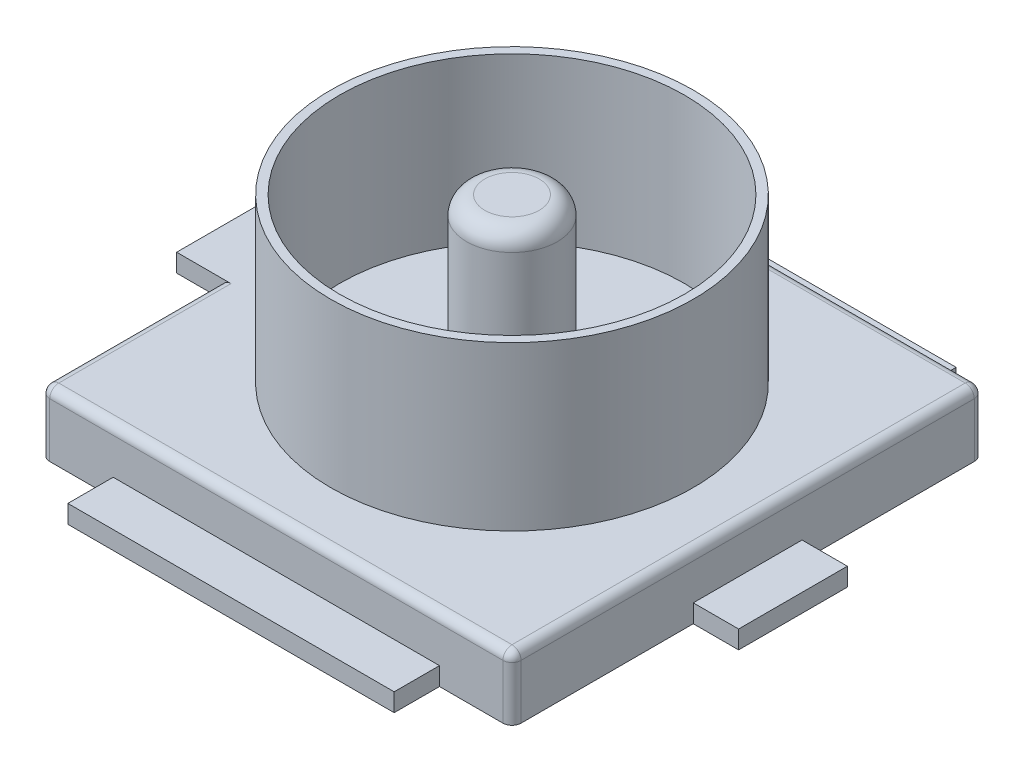
ISO-10303-21;
HEADER;
FILE_DESCRIPTION(('STEP AP214'),'2;1');
FILE_NAME('part.step','',(''),(''),'','','');
FILE_SCHEMA(('AUTOMOTIVE_DESIGN { 1 0 10303 214 1 1 1 1 }'));
ENDSEC;
DATA;
#1=APPLICATION_CONTEXT('core data for automotive mechanical design processes');
#2=APPLICATION_PROTOCOL_DEFINITION('international standard','automotive_design',2000,#1);
#3=PRODUCT_CONTEXT('',#1,'mechanical');
#4=PRODUCT('Part','Part','',(#3));
#5=PRODUCT_RELATED_PRODUCT_CATEGORY('part','',(#4));
#6=PRODUCT_DEFINITION_FORMATION('','',#4);
#7=PRODUCT_DEFINITION_CONTEXT('part definition',#1,'design');
#8=PRODUCT_DEFINITION('design','',#6,#7);
#9=PRODUCT_DEFINITION_SHAPE('','',#8);
#10=(LENGTH_UNIT() NAMED_UNIT(*) SI_UNIT(.MILLI.,.METRE.));
#11=(NAMED_UNIT(*) PLANE_ANGLE_UNIT() SI_UNIT($,.RADIAN.));
#12=(NAMED_UNIT(*) SI_UNIT($,.STERADIAN.) SOLID_ANGLE_UNIT());
#13=UNCERTAINTY_MEASURE_WITH_UNIT(LENGTH_MEASURE(1.E-05),#10,'distance_accuracy_value','');
#14=(GEOMETRIC_REPRESENTATION_CONTEXT(3) GLOBAL_UNCERTAINTY_ASSIGNED_CONTEXT((#13)) GLOBAL_UNIT_ASSIGNED_CONTEXT((#10,
#11,#12)) REPRESENTATION_CONTEXT('',''));
#15=CARTESIAN_POINT('',(0.,0.,0.));
#16=DIRECTION('',(0.,0.,1.));
#17=DIRECTION('',(1.,0.,0.));
#18=AXIS2_PLACEMENT_3D('',#15,#16,#17);
#19=CARTESIAN_POINT('',(0.,0.35,0.));
#20=DIRECTION('',(1.,0.,0.));
#21=DIRECTION('',(0.,0.,-1.));
#22=AXIS2_PLACEMENT_3D('',#19,#20,#21);
#23=PLANE('',#22);
#24=DIRECTION('',(0.,0.,1.));
#25=VECTOR('',#24,1.);
#26=CARTESIAN_POINT('',(0.,0.3,0.));
#27=LINE('',#26,#25);
#28=CARTESIAN_POINT('',(0.,0.3,-1.6));
#29=VERTEX_POINT('',#28);
#30=CARTESIAN_POINT('',(0.,0.3,-2.55));
#31=VERTEX_POINT('',#30);
#32=EDGE_CURVE('E291',#29,#31,#27,.F.);
#33=ORIENTED_EDGE('',*,*,#32,.T.);
#34=DIRECTION('',(0.,-1.,0.));
#35=VECTOR('',#34,1.);
#36=CARTESIAN_POINT('',(0.,0.35,-2.55));
#37=LINE('',#36,#35);
#38=CARTESIAN_POINT('',(0.,0.,-2.55));
#39=VERTEX_POINT('',#38);
#40=EDGE_CURVE('E331',#31,#39,#37,.T.);
#41=ORIENTED_EDGE('',*,*,#40,.T.);
#42=DIRECTION('',(0.,0.,1.));
#43=VECTOR('',#42,1.);
#44=CARTESIAN_POINT('',(0.,0.,0.));
#45=LINE('',#44,#43);
#46=CARTESIAN_POINT('',(0.,0.,-0.05));
#47=VERTEX_POINT('',#46);
#48=EDGE_CURVE('E431',#39,#47,#45,.T.);
#49=ORIENTED_EDGE('',*,*,#48,.T.);
#50=DIRECTION('',(0.,-1.,0.));
#51=VECTOR('',#50,1.);
#52=CARTESIAN_POINT('',(0.,0.35,-0.05));
#53=LINE('',#52,#51);
#54=CARTESIAN_POINT('',(0.,0.3,-0.05));
#55=VERTEX_POINT('',#54);
#56=EDGE_CURVE('E329',#47,#55,#53,.F.);
#57=ORIENTED_EDGE('',*,*,#56,.T.);
#58=DIRECTION('',(0.,0.,1.));
#59=VECTOR('',#58,1.);
#60=CARTESIAN_POINT('',(0.,0.3,0.));
#61=LINE('',#60,#59);
#62=CARTESIAN_POINT('',(0.,0.3,-0.999999999999999));
#63=VERTEX_POINT('',#62);
#64=EDGE_CURVE('E294',#55,#63,#61,.F.);
#65=ORIENTED_EDGE('',*,*,#64,.T.);
#66=DIRECTION('',(0.,1.,0.));
#67=VECTOR('',#66,1.);
#68=CARTESIAN_POINT('',(0.,0.35,-0.999999999999999));
#69=LINE('',#68,#67);
#70=CARTESIAN_POINT('',(0.,0.25,-0.999999999999999));
#71=VERTEX_POINT('',#70);
#72=EDGE_CURVE('E247',#71,#63,#69,.T.);
#73=ORIENTED_EDGE('',*,*,#72,.F.);
#74=DIRECTION('',(0.,0.,1.));
#75=VECTOR('',#74,1.);
#76=CARTESIAN_POINT('',(0.,0.25,-1.6));
#77=LINE('',#76,#75);
#78=CARTESIAN_POINT('',(0.,0.25,-1.6));
#79=VERTEX_POINT('',#78);
#80=EDGE_CURVE('E287',#79,#71,#77,.T.);
#81=ORIENTED_EDGE('',*,*,#80,.F.);
#82=DIRECTION('',(0.,-1.,0.));
#83=VECTOR('',#82,1.);
#84=CARTESIAN_POINT('',(0.,0.35,-1.6));
#85=LINE('',#84,#83);
#86=EDGE_CURVE('E251',#29,#79,#85,.T.);
#87=ORIENTED_EDGE('',*,*,#86,.F.);
#88=EDGE_LOOP('',(#33,#41,#49,#57,#65,#73,#81,#87));
#89=FACE_BOUND('',#88,.T.);
#90=ADVANCED_FACE('F45',(#89),#23,.F.);
#91=CARTESIAN_POINT('',(0.,0.35,-2.6));
#92=DIRECTION('',(0.,0.,1.));
#93=DIRECTION('',(1.,0.,0.));
#94=AXIS2_PLACEMENT_3D('',#91,#92,#93);
#95=PLANE('',#94);
#96=DIRECTION('',(-1.,0.,0.));
#97=VECTOR('',#96,1.);
#98=CARTESIAN_POINT('',(0.,0.,-2.6));
#99=LINE('',#98,#97);
#100=CARTESIAN_POINT('',(0.4,0.,-2.6));
#101=VERTEX_POINT('',#100);
#102=CARTESIAN_POINT('',(0.05,0.,-2.6));
#103=VERTEX_POINT('',#102);
#104=EDGE_CURVE('E338',#101,#103,#99,.T.);
#105=ORIENTED_EDGE('',*,*,#104,.T.);
#106=DIRECTION('',(0.,-1.,0.));
#107=VECTOR('',#106,1.);
#108=CARTESIAN_POINT('',(0.05,0.35,-2.6));
#109=LINE('',#108,#107);
#110=CARTESIAN_POINT('',(0.05,0.3,-2.6));
#111=VERTEX_POINT('',#110);
#112=EDGE_CURVE('E449',#103,#111,#109,.F.);
#113=ORIENTED_EDGE('',*,*,#112,.T.);
#114=DIRECTION('',(-1.,0.,0.));
#115=VECTOR('',#114,1.);
#116=CARTESIAN_POINT('',(0.,0.3,-2.6));
#117=LINE('',#116,#115);
#118=CARTESIAN_POINT('',(2.55,0.3,-2.6));
#119=VERTEX_POINT('',#118);
#120=EDGE_CURVE('E296',#111,#119,#117,.F.);
#121=ORIENTED_EDGE('',*,*,#120,.T.);
#122=DIRECTION('',(0.,-1.,0.));
#123=VECTOR('',#122,1.);
#124=CARTESIAN_POINT('',(2.55,0.35,-2.6));
#125=LINE('',#124,#123);
#126=CARTESIAN_POINT('',(2.55,0.,-2.6));
#127=VERTEX_POINT('',#126);
#128=EDGE_CURVE('E447',#119,#127,#125,.T.);
#129=ORIENTED_EDGE('',*,*,#128,.T.);
#130=CARTESIAN_POINT('',(2.2,0.,-2.6));
#131=VERTEX_POINT('',#130);
#132=EDGE_CURVE('E334',#127,#131,#99,.T.);
#133=ORIENTED_EDGE('',*,*,#132,.T.);
#134=DIRECTION('',(0.,-1.,0.));
#135=VECTOR('',#134,1.);
#136=CARTESIAN_POINT('',(2.2,0.,-2.6));
#137=LINE('',#136,#135);
#138=CARTESIAN_POINT('',(2.2,0.1,-2.6));
#139=VERTEX_POINT('',#138);
#140=EDGE_CURVE('E253',#139,#131,#137,.T.);
#141=ORIENTED_EDGE('',*,*,#140,.F.);
#142=DIRECTION('',(1.,0.,0.));
#143=VECTOR('',#142,1.);
#144=CARTESIAN_POINT('',(2.2,0.1,-2.6));
#145=LINE('',#144,#143);
#146=CARTESIAN_POINT('',(0.4,0.1,-2.6));
#147=VERTEX_POINT('',#146);
#148=EDGE_CURVE('E266',#147,#139,#145,.T.);
#149=ORIENTED_EDGE('',*,*,#148,.F.);
#150=DIRECTION('',(0.,1.,0.));
#151=VECTOR('',#150,1.);
#152=CARTESIAN_POINT('',(0.4,0.,-2.6));
#153=LINE('',#152,#151);
#154=EDGE_CURVE('E256',#101,#147,#153,.T.);
#155=ORIENTED_EDGE('',*,*,#154,.F.);
#156=EDGE_LOOP('',(#105,#113,#121,#129,#133,#141,#149,#155));
#157=FACE_BOUND('',#156,.T.);
#158=ADVANCED_FACE('F474',(#157),#95,.F.);
#159=CARTESIAN_POINT('',(0.,0.35,0.));
#160=DIRECTION('',(0.,0.,-1.));
#161=DIRECTION('',(-1.,0.,0.));
#162=AXIS2_PLACEMENT_3D('',#159,#160,#161);
#163=PLANE('',#162);
#164=DIRECTION('',(1.,0.,0.));
#165=VECTOR('',#164,1.);
#166=CARTESIAN_POINT('',(0.,0.3,0.));
#167=LINE('',#166,#165);
#168=CARTESIAN_POINT('',(2.55,0.3,0.));
#169=VERTEX_POINT('',#168);
#170=CARTESIAN_POINT('',(0.05,0.3,0.));
#171=VERTEX_POINT('',#170);
#172=EDGE_CURVE('E299',#169,#171,#167,.F.);
#173=ORIENTED_EDGE('',*,*,#172,.T.);
#174=DIRECTION('',(0.,-1.,0.));
#175=VECTOR('',#174,1.);
#176=CARTESIAN_POINT('',(0.05,0.35,0.));
#177=LINE('',#176,#175);
#178=CARTESIAN_POINT('',(0.05,0.,0.));
#179=VERTEX_POINT('',#178);
#180=EDGE_CURVE('E62',#171,#179,#177,.T.);
#181=ORIENTED_EDGE('',*,*,#180,.T.);
#182=DIRECTION('',(1.,0.,0.));
#183=VECTOR('',#182,1.);
#184=CARTESIAN_POINT('',(0.,0.,0.));
#185=LINE('',#184,#183);
#186=CARTESIAN_POINT('',(0.399999999999999,0.,0.));
#187=VERTEX_POINT('',#186);
#188=EDGE_CURVE('E438',#179,#187,#185,.T.);
#189=ORIENTED_EDGE('',*,*,#188,.T.);
#190=DIRECTION('',(0.,-1.,0.));
#191=VECTOR('',#190,1.);
#192=CARTESIAN_POINT('',(0.399999999999999,0.,0.));
#193=LINE('',#192,#191);
#194=CARTESIAN_POINT('',(0.399999999999999,0.1,0.));
#195=VERTEX_POINT('',#194);
#196=EDGE_CURVE('E352',#195,#187,#193,.T.);
#197=ORIENTED_EDGE('',*,*,#196,.F.);
#198=DIRECTION('',(-1.,0.,0.));
#199=VECTOR('',#198,1.);
#200=CARTESIAN_POINT('',(0.399999999999999,0.1,0.));
#201=LINE('',#200,#199);
#202=CARTESIAN_POINT('',(2.2,0.1,0.));
#203=VERTEX_POINT('',#202);
#204=EDGE_CURVE('E374',#203,#195,#201,.T.);
#205=ORIENTED_EDGE('',*,*,#204,.F.);
#206=DIRECTION('',(0.,1.,0.));
#207=VECTOR('',#206,1.);
#208=CARTESIAN_POINT('',(2.2,0.,0.));
#209=LINE('',#208,#207);
#210=CARTESIAN_POINT('',(2.2,0.,0.));
#211=VERTEX_POINT('',#210);
#212=EDGE_CURVE('E369',#211,#203,#209,.T.);
#213=ORIENTED_EDGE('',*,*,#212,.F.);
#214=CARTESIAN_POINT('',(2.55,0.,0.));
#215=VERTEX_POINT('',#214);
#216=EDGE_CURVE('E385',#211,#215,#185,.T.);
#217=ORIENTED_EDGE('',*,*,#216,.T.);
#218=DIRECTION('',(0.,-1.,0.));
#219=VECTOR('',#218,1.);
#220=CARTESIAN_POINT('',(2.55,0.35,0.));
#221=LINE('',#220,#219);
#222=EDGE_CURVE('E451',#215,#169,#221,.F.);
#223=ORIENTED_EDGE('',*,*,#222,.T.);
#224=EDGE_LOOP('',(#173,#181,#189,#197,#205,#213,#217,#223));
#225=FACE_BOUND('',#224,.T.);
#226=ADVANCED_FACE('F528',(#225),#163,.F.);
#227=CARTESIAN_POINT('',(2.6,0.35,0.));
#228=DIRECTION('',(-1.,0.,0.));
#229=DIRECTION('',(0.,0.,1.));
#230=AXIS2_PLACEMENT_3D('',#227,#228,#229);
#231=PLANE('',#230);
#232=DIRECTION('',(0.,0.,-1.));
#233=VECTOR('',#232,1.);
#234=CARTESIAN_POINT('',(2.6,0.3,0.));
#235=LINE('',#234,#233);
#236=CARTESIAN_POINT('',(2.6,0.3,-2.55));
#237=VERTEX_POINT('',#236);
#238=CARTESIAN_POINT('',(2.6,0.3,-0.05));
#239=VERTEX_POINT('',#238);
#240=EDGE_CURVE('E301',#237,#239,#235,.F.);
#241=ORIENTED_EDGE('',*,*,#240,.T.);
#242=DIRECTION('',(0.,-1.,0.));
#243=VECTOR('',#242,1.);
#244=CARTESIAN_POINT('',(2.6,0.35,-0.05));
#245=LINE('',#244,#243);
#246=CARTESIAN_POINT('',(2.6,0.,-0.05));
#247=VERTEX_POINT('',#246);
#248=EDGE_CURVE('E12',#239,#247,#245,.T.);
#249=ORIENTED_EDGE('',*,*,#248,.T.);
#250=DIRECTION('',(0.,0.,-1.));
#251=VECTOR('',#250,1.);
#252=CARTESIAN_POINT('',(2.6,0.,0.));
#253=LINE('',#252,#251);
#254=CARTESIAN_POINT('',(2.6,0.,-0.999999999999999));
#255=VERTEX_POINT('',#254);
#256=EDGE_CURVE('E339',#247,#255,#253,.T.);
#257=ORIENTED_EDGE('',*,*,#256,.T.);
#258=DIRECTION('',(0.,-1.,0.));
#259=VECTOR('',#258,1.);
#260=CARTESIAN_POINT('',(2.6,0.,-0.999999999999999));
#261=LINE('',#260,#259);
#262=CARTESIAN_POINT('',(2.6,0.1,-0.999999999999999));
#263=VERTEX_POINT('',#262);
#264=EDGE_CURVE('E396',#263,#255,#261,.T.);
#265=ORIENTED_EDGE('',*,*,#264,.F.);
#266=DIRECTION('',(0.,0.,1.));
#267=VECTOR('',#266,1.);
#268=CARTESIAN_POINT('',(2.6,0.1,-0.999999999999999));
#269=LINE('',#268,#267);
#270=CARTESIAN_POINT('',(2.6,0.1,-1.6));
#271=VERTEX_POINT('',#270);
#272=EDGE_CURVE('E404',#271,#263,#269,.T.);
#273=ORIENTED_EDGE('',*,*,#272,.F.);
#274=DIRECTION('',(0.,1.,0.));
#275=VECTOR('',#274,1.);
#276=CARTESIAN_POINT('',(2.6,0.,-1.6));
#277=LINE('',#276,#275);
#278=CARTESIAN_POINT('',(2.6,0.,-1.6));
#279=VERTEX_POINT('',#278);
#280=EDGE_CURVE('E399',#279,#271,#277,.T.);
#281=ORIENTED_EDGE('',*,*,#280,.F.);
#282=CARTESIAN_POINT('',(2.6,0.,-2.55));
#283=VERTEX_POINT('',#282);
#284=EDGE_CURVE('E440',#279,#283,#253,.T.);
#285=ORIENTED_EDGE('',*,*,#284,.T.);
#286=DIRECTION('',(0.,-1.,0.));
#287=VECTOR('',#286,1.);
#288=CARTESIAN_POINT('',(2.6,0.35,-2.55));
#289=LINE('',#288,#287);
#290=EDGE_CURVE('E54',#283,#237,#289,.F.);
#291=ORIENTED_EDGE('',*,*,#290,.T.);
#292=EDGE_LOOP('',(#241,#249,#257,#265,#273,#281,#285,#291));
#293=FACE_BOUND('',#292,.T.);
#294=ADVANCED_FACE('F483',(#293),#231,.F.);
#295=CARTESIAN_POINT('',(0.,0.35,0.));
#296=DIRECTION('',(0.,-1.,0.));
#297=DIRECTION('',(0.,0.,-1.));
#298=AXIS2_PLACEMENT_3D('',#295,#296,#297);
#299=PLANE('',#298);
#300=CARTESIAN_POINT('',(1.3,0.35,-1.3));
#301=DIRECTION('',(0.,1.,0.));
#302=DIRECTION('',(0.,0.,1.));
#303=AXIS2_PLACEMENT_3D('',#300,#301,#302);
#304=CIRCLE('',#303,0.951541018536383);
#305=CARTESIAN_POINT('',(1.3,0.35,-0.348458981463616));
#306=VERTEX_POINT('',#305);
#307=EDGE_CURVE('E428',#306,#306,#304,.T.);
#308=ORIENTED_EDGE('',*,*,#307,.T.);
#309=EDGE_LOOP('',(#308));
#310=FACE_BOUND('',#309,.T.);
#311=CARTESIAN_POINT('',(1.3,0.35,-1.3));
#312=DIRECTION('',(0.,-1.,0.));
#313=DIRECTION('',(0.,0.,-1.));
#314=AXIS2_PLACEMENT_3D('',#311,#312,#313);
#315=CIRCLE('',#314,0.25);
#316=CARTESIAN_POINT('',(1.3,0.35,-1.55));
#317=VERTEX_POINT('',#316);
#318=EDGE_CURVE('E337',#317,#317,#315,.F.);
#319=ORIENTED_EDGE('',*,*,#318,.F.);
#320=EDGE_LOOP('',(#319));
#321=FACE_BOUND('',#320,.T.);
#322=ADVANCED_FACE('F794',(#310,#321),#299,.F.);
#323=CARTESIAN_POINT('',(1.3,1.25,-1.3));
#324=DIRECTION('',(0.,-1.,0.));
#325=DIRECTION('',(0.,0.,-1.));
#326=AXIS2_PLACEMENT_3D('',#323,#324,#325);
#327=CYLINDRICAL_SURFACE('',#326,0.25);
#328=CARTESIAN_POINT('',(1.3,1.15,-1.3));
#329=DIRECTION('',(0.,1.,0.));
#330=DIRECTION('',(0.,0.,1.));
#331=AXIS2_PLACEMENT_3D('',#328,#329,#330);
#332=CIRCLE('',#331,0.25);
#333=CARTESIAN_POINT('',(1.3,1.15,-1.05));
#334=VERTEX_POINT('',#333);
#335=EDGE_CURVE('E905',#334,#334,#332,.F.);
#336=ORIENTED_EDGE('',*,*,#335,.T.);
#337=EDGE_LOOP('',(#336));
#338=FACE_BOUND('',#337,.T.);
#339=ORIENTED_EDGE('',*,*,#318,.T.);
#340=EDGE_LOOP('',(#339));
#341=FACE_BOUND('',#340,.T.);
#342=ADVANCED_FACE('F798',(#338,#341),#327,.T.);
#343=CARTESIAN_POINT('',(0.,1.25,0.));
#344=DIRECTION('',(0.,1.,0.));
#345=DIRECTION('',(0.,0.,1.));
#346=AXIS2_PLACEMENT_3D('',#343,#344,#345);
#347=PLANE('',#346);
#348=CARTESIAN_POINT('',(1.3,1.25,-1.3));
#349=DIRECTION('',(0.,1.,0.));
#350=DIRECTION('',(0.,0.,1.));
#351=AXIS2_PLACEMENT_3D('',#348,#349,#350);
#352=CIRCLE('',#351,0.15);
#353=CARTESIAN_POINT('',(1.3,1.25,-1.15));
#354=VERTEX_POINT('',#353);
#355=EDGE_CURVE('E908',#354,#354,#352,.T.);
#356=ORIENTED_EDGE('',*,*,#355,.T.);
#357=EDGE_LOOP('',(#356));
#358=FACE_BOUND('',#357,.T.);
#359=ADVANCED_FACE('F786',(#358),#347,.T.);
#360=CARTESIAN_POINT('',(1.3,1.25,-1.3));
#361=DIRECTION('',(0.,-1.,0.));
#362=DIRECTION('',(0.,0.,-1.));
#363=AXIS2_PLACEMENT_3D('',#360,#361,#362);
#364=CYLINDRICAL_SURFACE('',#363,0.951541018536383);
#365=CARTESIAN_POINT('',(1.3,1.25,-1.3));
#366=DIRECTION('',(0.,1.,0.));
#367=DIRECTION('',(0.,0.,1.));
#368=AXIS2_PLACEMENT_3D('',#365,#366,#367);
#369=CIRCLE('',#368,0.951541018536383);
#370=CARTESIAN_POINT('',(1.3,1.25,-0.348458981463616));
#371=VERTEX_POINT('',#370);
#372=EDGE_CURVE('E424',#371,#371,#369,.T.);
#373=ORIENTED_EDGE('',*,*,#372,.T.);
#374=EDGE_LOOP('',(#373));
#375=FACE_BOUND('',#374,.T.);
#376=ORIENTED_EDGE('',*,*,#307,.F.);
#377=EDGE_LOOP('',(#376));
#378=FACE_BOUND('',#377,.T.);
#379=ADVANCED_FACE('F776',(#375,#378),#364,.F.);
#380=CARTESIAN_POINT('',(1.3,1.25,-1.3));
#381=DIRECTION('',(0.,-1.,0.));
#382=DIRECTION('',(0.,0.,-1.));
#383=AXIS2_PLACEMENT_3D('',#380,#381,#382);
#384=CYLINDRICAL_SURFACE('',#383,1.);
#385=CARTESIAN_POINT('',(1.3,1.25,-1.3));
#386=DIRECTION('',(0.,1.,0.));
#387=DIRECTION('',(0.,0.,1.));
#388=AXIS2_PLACEMENT_3D('',#385,#386,#387);
#389=CIRCLE('',#388,1.);
#390=CARTESIAN_POINT('',(1.3,1.25,-0.299999999999999));
#391=VERTEX_POINT('',#390);
#392=EDGE_CURVE('E427',#391,#391,#389,.T.);
#393=ORIENTED_EDGE('',*,*,#392,.F.);
#394=EDGE_LOOP('',(#393));
#395=FACE_BOUND('',#394,.T.);
#396=CARTESIAN_POINT('',(1.3,0.35,-1.3));
#397=DIRECTION('',(0.,-1.,0.));
#398=DIRECTION('',(0.,0.,-1.));
#399=AXIS2_PLACEMENT_3D('',#396,#397,#398);
#400=CIRCLE('',#399,1.);
#401=CARTESIAN_POINT('',(1.3,0.35,-2.3));
#402=VERTEX_POINT('',#401);
#403=EDGE_CURVE('E486',#402,#402,#400,.F.);
#404=ORIENTED_EDGE('',*,*,#403,.T.);
#405=EDGE_LOOP('',(#404));
#406=FACE_BOUND('',#405,.T.);
#407=ADVANCED_FACE('F764',(#395,#406),#384,.T.);
#408=CARTESIAN_POINT('',(0.,1.25,0.));
#409=DIRECTION('',(0.,1.,0.));
#410=DIRECTION('',(0.,0.,1.));
#411=AXIS2_PLACEMENT_3D('',#408,#409,#410);
#412=PLANE('',#411);
#413=ORIENTED_EDGE('',*,*,#372,.F.);
#414=EDGE_LOOP('',(#413));
#415=FACE_BOUND('',#414,.T.);
#416=ORIENTED_EDGE('',*,*,#392,.T.);
#417=EDGE_LOOP('',(#416));
#418=FACE_BOUND('',#417,.T.);
#419=ADVANCED_FACE('F759',(#415,#418),#412,.T.);
#420=CARTESIAN_POINT('',(0.,0.,0.));
#421=DIRECTION('',(0.,-1.,0.));
#422=DIRECTION('',(0.,0.,-1.));
#423=AXIS2_PLACEMENT_3D('',#420,#421,#422);
#424=PLANE('',#423);
#425=ORIENTED_EDGE('',*,*,#48,.F.);
#426=CARTESIAN_POINT('',(0.05,0.,-2.55));
#427=DIRECTION('',(0.,-1.,0.));
#428=DIRECTION('',(0.,0.,-1.));
#429=AXIS2_PLACEMENT_3D('',#426,#427,#428);
#430=CIRCLE('',#429,0.05);
#431=EDGE_CURVE('E445',#39,#103,#430,.T.);
#432=ORIENTED_EDGE('',*,*,#431,.T.);
#433=ORIENTED_EDGE('',*,*,#104,.F.);
#434=DIRECTION('',(0.,0.,1.));
#435=VECTOR('',#434,1.);
#436=CARTESIAN_POINT('',(0.4,0.,-2.85));
#437=LINE('',#436,#435);
#438=CARTESIAN_POINT('',(0.4,0.,-2.85));
#439=VERTEX_POINT('',#438);
#440=EDGE_CURVE('E359',#439,#101,#437,.T.);
#441=ORIENTED_EDGE('',*,*,#440,.F.);
#442=DIRECTION('',(-1.,0.,0.));
#443=VECTOR('',#442,1.);
#444=CARTESIAN_POINT('',(2.2,0.,-2.85));
#445=LINE('',#444,#443);
#446=CARTESIAN_POINT('',(2.2,0.,-2.85));
#447=VERTEX_POINT('',#446);
#448=EDGE_CURVE('E265',#447,#439,#445,.T.);
#449=ORIENTED_EDGE('',*,*,#448,.F.);
#450=DIRECTION('',(0.,0.,1.));
#451=VECTOR('',#450,1.);
#452=CARTESIAN_POINT('',(2.2,0.,-2.85));
#453=LINE('',#452,#451);
#454=EDGE_CURVE('E362',#447,#131,#453,.T.);
#455=ORIENTED_EDGE('',*,*,#454,.T.);
#456=ORIENTED_EDGE('',*,*,#132,.F.);
#457=CARTESIAN_POINT('',(2.55,0.,-2.55));
#458=DIRECTION('',(0.,-1.,0.));
#459=DIRECTION('',(0.,0.,-1.));
#460=AXIS2_PLACEMENT_3D('',#457,#458,#459);
#461=CIRCLE('',#460,0.05);
#462=EDGE_CURVE('E333',#127,#283,#461,.T.);
#463=ORIENTED_EDGE('',*,*,#462,.T.);
#464=ORIENTED_EDGE('',*,*,#284,.F.);
#465=DIRECTION('',(-1.,0.,0.));
#466=VECTOR('',#465,1.);
#467=CARTESIAN_POINT('',(2.85,0.,-1.6));
#468=LINE('',#467,#466);
#469=CARTESIAN_POINT('',(2.85,0.,-1.6));
#470=VERTEX_POINT('',#469);
#471=EDGE_CURVE('E423',#470,#279,#468,.T.);
#472=ORIENTED_EDGE('',*,*,#471,.F.);
#473=DIRECTION('',(0.,0.,-1.));
#474=VECTOR('',#473,1.);
#475=CARTESIAN_POINT('',(2.85,0.,-0.999999999999999));
#476=LINE('',#475,#474);
#477=CARTESIAN_POINT('',(2.85,0.,-0.999999999999999));
#478=VERTEX_POINT('',#477);
#479=EDGE_CURVE('E493',#478,#470,#476,.T.);
#480=ORIENTED_EDGE('',*,*,#479,.F.);
#481=DIRECTION('',(-1.,0.,0.));
#482=VECTOR('',#481,1.);
#483=CARTESIAN_POINT('',(2.85,0.,-0.999999999999999));
#484=LINE('',#483,#482);
#485=EDGE_CURVE('E434',#478,#255,#484,.T.);
#486=ORIENTED_EDGE('',*,*,#485,.T.);
#487=ORIENTED_EDGE('',*,*,#256,.F.);
#488=CARTESIAN_POINT('',(2.55,0.,-0.05));
#489=DIRECTION('',(0.,-1.,0.));
#490=DIRECTION('',(0.,0.,-1.));
#491=AXIS2_PLACEMENT_3D('',#488,#489,#490);
#492=CIRCLE('',#491,0.05);
#493=EDGE_CURVE('E70',#247,#215,#492,.T.);
#494=ORIENTED_EDGE('',*,*,#493,.T.);
#495=ORIENTED_EDGE('',*,*,#216,.F.);
#496=DIRECTION('',(0.,0.,-1.));
#497=VECTOR('',#496,1.);
#498=CARTESIAN_POINT('',(2.2,0.,0.25));
#499=LINE('',#498,#497);
#500=CARTESIAN_POINT('',(2.2,0.,0.25));
#501=VERTEX_POINT('',#500);
#502=EDGE_CURVE('E389',#501,#211,#499,.T.);
#503=ORIENTED_EDGE('',*,*,#502,.F.);
#504=DIRECTION('',(1.,0.,0.));
#505=VECTOR('',#504,1.);
#506=CARTESIAN_POINT('',(0.399999999999999,0.,0.25));
#507=LINE('',#506,#505);
#508=CARTESIAN_POINT('',(0.399999999999999,0.,0.25));
#509=VERTEX_POINT('',#508);
#510=EDGE_CURVE('E940',#509,#501,#507,.T.);
#511=ORIENTED_EDGE('',*,*,#510,.F.);
#512=DIRECTION('',(0.,0.,-1.));
#513=VECTOR('',#512,1.);
#514=CARTESIAN_POINT('',(0.399999999999999,0.,0.25));
#515=LINE('',#514,#513);
#516=EDGE_CURVE('E391',#509,#187,#515,.T.);
#517=ORIENTED_EDGE('',*,*,#516,.T.);
#518=ORIENTED_EDGE('',*,*,#188,.F.);
#519=CARTESIAN_POINT('',(0.05,0.,-0.05));
#520=DIRECTION('',(0.,-1.,0.));
#521=DIRECTION('',(0.,0.,-1.));
#522=AXIS2_PLACEMENT_3D('',#519,#520,#521);
#523=CIRCLE('',#522,0.05);
#524=EDGE_CURVE('E443',#179,#47,#523,.T.);
#525=ORIENTED_EDGE('',*,*,#524,.T.);
#526=EDGE_LOOP('',(#425,#432,#433,#441,#449,#455,#456,#463,#464,#472,#480,#486,#487,#494,#495,
#503,#511,#517,#518,#525));
#527=FACE_BOUND('',#526,.T.);
#528=ADVANCED_FACE('F477',(#527),#424,.T.);
#529=DIRECTION('',(1.,0.,0.));
#530=VECTOR('',#529,1.);
#531=CARTESIAN_POINT('',(-0.25,0.35,-0.999999999999999));
#532=LINE('',#531,#530);
#533=CARTESIAN_POINT('',(-0.25,0.35,-0.999999999999999));
#534=VERTEX_POINT('',#533);
#535=CARTESIAN_POINT('',(0.05,0.35,-0.999999999999999));
#536=VERTEX_POINT('',#535);
#537=EDGE_CURVE('E258',#534,#536,#532,.T.);
#538=ORIENTED_EDGE('',*,*,#537,.T.);
#539=DIRECTION('',(0.,0.,1.));
#540=VECTOR('',#539,1.);
#541=CARTESIAN_POINT('',(0.05,0.35,0.));
#542=LINE('',#541,#540);
#543=CARTESIAN_POINT('',(0.05,0.35,-0.05));
#544=VERTEX_POINT('',#543);
#545=EDGE_CURVE('E289',#536,#544,#542,.T.);
#546=ORIENTED_EDGE('',*,*,#545,.T.);
#547=DIRECTION('',(1.,0.,0.));
#548=VECTOR('',#547,1.);
#549=CARTESIAN_POINT('',(0.,0.35,-0.05));
#550=LINE('',#549,#548);
#551=CARTESIAN_POINT('',(2.55,0.35,-0.05));
#552=VERTEX_POINT('',#551);
#553=EDGE_CURVE('E889',#544,#552,#550,.T.);
#554=ORIENTED_EDGE('',*,*,#553,.T.);
#555=DIRECTION('',(0.,0.,-1.));
#556=VECTOR('',#555,1.);
#557=CARTESIAN_POINT('',(2.55,0.35,0.));
#558=LINE('',#557,#556);
#559=CARTESIAN_POINT('',(2.55,0.35,-2.55));
#560=VERTEX_POINT('',#559);
#561=EDGE_CURVE('E893',#552,#560,#558,.T.);
#562=ORIENTED_EDGE('',*,*,#561,.T.);
#563=DIRECTION('',(-1.,0.,0.));
#564=VECTOR('',#563,1.);
#565=CARTESIAN_POINT('',(0.,0.35,-2.55));
#566=LINE('',#565,#564);
#567=CARTESIAN_POINT('',(0.05,0.35,-2.55));
#568=VERTEX_POINT('',#567);
#569=EDGE_CURVE('E892',#560,#568,#566,.T.);
#570=ORIENTED_EDGE('',*,*,#569,.T.);
#571=DIRECTION('',(0.,0.,1.));
#572=VECTOR('',#571,1.);
#573=CARTESIAN_POINT('',(0.05,0.35,0.));
#574=LINE('',#573,#572);
#575=CARTESIAN_POINT('',(0.05,0.35,-1.6));
#576=VERTEX_POINT('',#575);
#577=EDGE_CURVE('E897',#568,#576,#574,.T.);
#578=ORIENTED_EDGE('',*,*,#577,.T.);
#579=DIRECTION('',(1.,0.,0.));
#580=VECTOR('',#579,1.);
#581=CARTESIAN_POINT('',(-0.25,0.35,-1.6));
#582=LINE('',#581,#580);
#583=CARTESIAN_POINT('',(-0.25,0.35,-1.6));
#584=VERTEX_POINT('',#583);
#585=EDGE_CURVE('E282',#584,#576,#582,.T.);
#586=ORIENTED_EDGE('',*,*,#585,.F.);
#587=DIRECTION('',(0.,0.,-1.));
#588=VECTOR('',#587,1.);
#589=CARTESIAN_POINT('',(-0.25,0.35,-1.6));
#590=LINE('',#589,#588);
#591=EDGE_CURVE('E244',#534,#584,#590,.T.);
#592=ORIENTED_EDGE('',*,*,#591,.F.);
#593=EDGE_LOOP('',(#538,#546,#554,#562,#570,#578,#586,#592));
#594=FACE_BOUND('',#593,.T.);
#595=ORIENTED_EDGE('',*,*,#403,.F.);
#596=EDGE_LOOP('',(#595));
#597=FACE_BOUND('',#596,.T.);
#598=ADVANCED_FACE('F519',(#594,#597),#299,.F.);
#599=CARTESIAN_POINT('',(2.85,0.,-0.999999999999999));
#600=DIRECTION('',(0.,0.,-1.));
#601=DIRECTION('',(-1.,0.,0.));
#602=AXIS2_PLACEMENT_3D('',#599,#600,#601);
#603=PLANE('',#602);
#604=ORIENTED_EDGE('',*,*,#264,.T.);
#605=ORIENTED_EDGE('',*,*,#485,.F.);
#606=DIRECTION('',(0.,-1.,0.));
#607=VECTOR('',#606,1.);
#608=CARTESIAN_POINT('',(2.85,0.,-0.999999999999999));
#609=LINE('',#608,#607);
#610=CARTESIAN_POINT('',(2.85,0.1,-0.999999999999999));
#611=VERTEX_POINT('',#610);
#612=EDGE_CURVE('E417',#611,#478,#609,.T.);
#613=ORIENTED_EDGE('',*,*,#612,.F.);
#614=DIRECTION('',(-1.,0.,0.));
#615=VECTOR('',#614,1.);
#616=CARTESIAN_POINT('',(2.85,0.1,-0.999999999999999));
#617=LINE('',#616,#615);
#618=EDGE_CURVE('E418',#611,#263,#617,.T.);
#619=ORIENTED_EDGE('',*,*,#618,.T.);
#620=EDGE_LOOP('',(#604,#605,#613,#619));
#621=FACE_BOUND('',#620,.T.);
#622=ADVANCED_FACE('F496',(#621),#603,.F.);
#623=CARTESIAN_POINT('',(2.85,0.,-1.6));
#624=DIRECTION('',(0.,0.,1.));
#625=DIRECTION('',(1.,0.,0.));
#626=AXIS2_PLACEMENT_3D('',#623,#624,#625);
#627=PLANE('',#626);
#628=ORIENTED_EDGE('',*,*,#280,.T.);
#629=DIRECTION('',(-1.,0.,0.));
#630=VECTOR('',#629,1.);
#631=CARTESIAN_POINT('',(2.85,0.1,-1.6));
#632=LINE('',#631,#630);
#633=CARTESIAN_POINT('',(2.85,0.1,-1.6));
#634=VERTEX_POINT('',#633);
#635=EDGE_CURVE('E420',#634,#271,#632,.T.);
#636=ORIENTED_EDGE('',*,*,#635,.F.);
#637=DIRECTION('',(0.,1.,0.));
#638=VECTOR('',#637,1.);
#639=CARTESIAN_POINT('',(2.85,0.,-1.6));
#640=LINE('',#639,#638);
#641=EDGE_CURVE('E500',#470,#634,#640,.T.);
#642=ORIENTED_EDGE('',*,*,#641,.F.);
#643=ORIENTED_EDGE('',*,*,#471,.T.);
#644=EDGE_LOOP('',(#628,#636,#642,#643));
#645=FACE_BOUND('',#644,.T.);
#646=ADVANCED_FACE('F511',(#645),#627,.F.);
#647=CARTESIAN_POINT('',(2.85,0.1,-0.999999999999999));
#648=DIRECTION('',(0.,-1.,0.));
#649=DIRECTION('',(0.,0.,-1.));
#650=AXIS2_PLACEMENT_3D('',#647,#648,#649);
#651=PLANE('',#650);
#652=ORIENTED_EDGE('',*,*,#272,.T.);
#653=ORIENTED_EDGE('',*,*,#618,.F.);
#654=DIRECTION('',(0.,0.,1.));
#655=VECTOR('',#654,1.);
#656=CARTESIAN_POINT('',(2.85,0.1,-0.999999999999999));
#657=LINE('',#656,#655);
#658=EDGE_CURVE('E413',#634,#611,#657,.T.);
#659=ORIENTED_EDGE('',*,*,#658,.F.);
#660=ORIENTED_EDGE('',*,*,#635,.T.);
#661=EDGE_LOOP('',(#652,#653,#659,#660));
#662=FACE_BOUND('',#661,.T.);
#663=ADVANCED_FACE('F509',(#662),#651,.F.);
#664=CARTESIAN_POINT('',(2.85,0.,0.));
#665=DIRECTION('',(-1.,0.,0.));
#666=DIRECTION('',(0.,0.,1.));
#667=AXIS2_PLACEMENT_3D('',#664,#665,#666);
#668=PLANE('',#667);
#669=ORIENTED_EDGE('',*,*,#612,.T.);
#670=ORIENTED_EDGE('',*,*,#479,.T.);
#671=ORIENTED_EDGE('',*,*,#641,.T.);
#672=ORIENTED_EDGE('',*,*,#658,.T.);
#673=EDGE_LOOP('',(#669,#670,#671,#672));
#674=FACE_BOUND('',#673,.T.);
#675=ADVANCED_FACE('F507',(#674),#668,.F.);
#676=CARTESIAN_POINT('',(0.399999999999999,0.,0.25));
#677=DIRECTION('',(1.,0.,0.));
#678=DIRECTION('',(0.,0.,-1.));
#679=AXIS2_PLACEMENT_3D('',#676,#677,#678);
#680=PLANE('',#679);
#681=ORIENTED_EDGE('',*,*,#196,.T.);
#682=ORIENTED_EDGE('',*,*,#516,.F.);
#683=DIRECTION('',(0.,-1.,0.));
#684=VECTOR('',#683,1.);
#685=CARTESIAN_POINT('',(0.399999999999999,0.,0.25));
#686=LINE('',#685,#684);
#687=CARTESIAN_POINT('',(0.399999999999999,0.1,0.25));
#688=VERTEX_POINT('',#687);
#689=EDGE_CURVE('E381',#688,#509,#686,.T.);
#690=ORIENTED_EDGE('',*,*,#689,.F.);
#691=DIRECTION('',(0.,0.,-1.));
#692=VECTOR('',#691,1.);
#693=CARTESIAN_POINT('',(0.399999999999999,0.1,0.25));
#694=LINE('',#693,#692);
#695=EDGE_CURVE('E931',#688,#195,#694,.T.);
#696=ORIENTED_EDGE('',*,*,#695,.T.);
#697=EDGE_LOOP('',(#681,#682,#690,#696));
#698=FACE_BOUND('',#697,.T.);
#699=ADVANCED_FACE('F725',(#698),#680,.F.);
#700=CARTESIAN_POINT('',(2.2,0.,0.25));
#701=DIRECTION('',(-1.,0.,0.));
#702=DIRECTION('',(0.,0.,1.));
#703=AXIS2_PLACEMENT_3D('',#700,#701,#702);
#704=PLANE('',#703);
#705=ORIENTED_EDGE('',*,*,#212,.T.);
#706=DIRECTION('',(0.,0.,-1.));
#707=VECTOR('',#706,1.);
#708=CARTESIAN_POINT('',(2.2,0.1,0.25));
#709=LINE('',#708,#707);
#710=CARTESIAN_POINT('',(2.2,0.1,0.25));
#711=VERTEX_POINT('',#710);
#712=EDGE_CURVE('E392',#711,#203,#709,.T.);
#713=ORIENTED_EDGE('',*,*,#712,.F.);
#714=DIRECTION('',(0.,1.,0.));
#715=VECTOR('',#714,1.);
#716=CARTESIAN_POINT('',(2.2,0.,0.25));
#717=LINE('',#716,#715);
#718=EDGE_CURVE('E935',#501,#711,#717,.T.);
#719=ORIENTED_EDGE('',*,*,#718,.F.);
#720=ORIENTED_EDGE('',*,*,#502,.T.);
#721=EDGE_LOOP('',(#705,#713,#719,#720));
#722=FACE_BOUND('',#721,.T.);
#723=ADVANCED_FACE('F717',(#722),#704,.F.);
#724=CARTESIAN_POINT('',(0.399999999999999,0.1,0.25));
#725=DIRECTION('',(0.,-1.,0.));
#726=DIRECTION('',(0.,0.,-1.));
#727=AXIS2_PLACEMENT_3D('',#724,#725,#726);
#728=PLANE('',#727);
#729=ORIENTED_EDGE('',*,*,#204,.T.);
#730=ORIENTED_EDGE('',*,*,#695,.F.);
#731=DIRECTION('',(-1.,0.,0.));
#732=VECTOR('',#731,1.);
#733=CARTESIAN_POINT('',(0.399999999999999,0.1,0.25));
#734=LINE('',#733,#732);
#735=EDGE_CURVE('E934',#711,#688,#734,.T.);
#736=ORIENTED_EDGE('',*,*,#735,.F.);
#737=ORIENTED_EDGE('',*,*,#712,.T.);
#738=EDGE_LOOP('',(#729,#730,#736,#737));
#739=FACE_BOUND('',#738,.T.);
#740=ADVANCED_FACE('F709',(#739),#728,.F.);
#741=CARTESIAN_POINT('',(0.,0.,0.25));
#742=DIRECTION('',(0.,0.,-1.));
#743=DIRECTION('',(-1.,0.,0.));
#744=AXIS2_PLACEMENT_3D('',#741,#742,#743);
#745=PLANE('',#744);
#746=ORIENTED_EDGE('',*,*,#689,.T.);
#747=ORIENTED_EDGE('',*,*,#510,.T.);
#748=ORIENTED_EDGE('',*,*,#718,.T.);
#749=ORIENTED_EDGE('',*,*,#735,.T.);
#750=EDGE_LOOP('',(#746,#747,#748,#749));
#751=FACE_BOUND('',#750,.T.);
#752=ADVANCED_FACE('F701',(#751),#745,.F.);
#753=CARTESIAN_POINT('',(2.2,0.,-2.85));
#754=DIRECTION('',(-1.,0.,0.));
#755=DIRECTION('',(0.,0.,1.));
#756=AXIS2_PLACEMENT_3D('',#753,#754,#755);
#757=PLANE('',#756);
#758=ORIENTED_EDGE('',*,*,#140,.T.);
#759=ORIENTED_EDGE('',*,*,#454,.F.);
#760=DIRECTION('',(0.,-1.,0.));
#761=VECTOR('',#760,1.);
#762=CARTESIAN_POINT('',(2.2,0.,-2.85));
#763=LINE('',#762,#761);
#764=CARTESIAN_POINT('',(2.2,0.1,-2.85));
#765=VERTEX_POINT('',#764);
#766=EDGE_CURVE('E262',#765,#447,#763,.T.);
#767=ORIENTED_EDGE('',*,*,#766,.F.);
#768=DIRECTION('',(0.,0.,1.));
#769=VECTOR('',#768,1.);
#770=CARTESIAN_POINT('',(2.2,0.1,-2.85));
#771=LINE('',#770,#769);
#772=EDGE_CURVE('E272',#765,#139,#771,.T.);
#773=ORIENTED_EDGE('',*,*,#772,.T.);
#774=EDGE_LOOP('',(#758,#759,#767,#773));
#775=FACE_BOUND('',#774,.T.);
#776=ADVANCED_FACE('F693',(#775),#757,.F.);
#777=CARTESIAN_POINT('',(0.4,0.,-2.85));
#778=DIRECTION('',(1.,0.,0.));
#779=DIRECTION('',(0.,0.,-1.));
#780=AXIS2_PLACEMENT_3D('',#777,#778,#779);
#781=PLANE('',#780);
#782=ORIENTED_EDGE('',*,*,#154,.T.);
#783=DIRECTION('',(0.,0.,1.));
#784=VECTOR('',#783,1.);
#785=CARTESIAN_POINT('',(0.4,0.1,-2.85));
#786=LINE('',#785,#784);
#787=CARTESIAN_POINT('',(0.4,0.1,-2.85));
#788=VERTEX_POINT('',#787);
#789=EDGE_CURVE('E363',#788,#147,#786,.T.);
#790=ORIENTED_EDGE('',*,*,#789,.F.);
#791=DIRECTION('',(0.,1.,0.));
#792=VECTOR('',#791,1.);
#793=CARTESIAN_POINT('',(0.4,0.,-2.85));
#794=LINE('',#793,#792);
#795=EDGE_CURVE('E268',#439,#788,#794,.T.);
#796=ORIENTED_EDGE('',*,*,#795,.F.);
#797=ORIENTED_EDGE('',*,*,#440,.T.);
#798=EDGE_LOOP('',(#782,#790,#796,#797));
#799=FACE_BOUND('',#798,.T.);
#800=ADVANCED_FACE('F685',(#799),#781,.F.);
#801=CARTESIAN_POINT('',(2.2,0.1,-2.85));
#802=DIRECTION('',(0.,-1.,0.));
#803=DIRECTION('',(0.,0.,-1.));
#804=AXIS2_PLACEMENT_3D('',#801,#802,#803);
#805=PLANE('',#804);
#806=ORIENTED_EDGE('',*,*,#148,.T.);
#807=ORIENTED_EDGE('',*,*,#772,.F.);
#808=DIRECTION('',(1.,0.,0.));
#809=VECTOR('',#808,1.);
#810=CARTESIAN_POINT('',(2.2,0.1,-2.85));
#811=LINE('',#810,#809);
#812=EDGE_CURVE('E270',#788,#765,#811,.T.);
#813=ORIENTED_EDGE('',*,*,#812,.F.);
#814=ORIENTED_EDGE('',*,*,#789,.T.);
#815=EDGE_LOOP('',(#806,#807,#813,#814));
#816=FACE_BOUND('',#815,.T.);
#817=ADVANCED_FACE('F677',(#816),#805,.F.);
#818=CARTESIAN_POINT('',(0.,0.,-2.85));
#819=DIRECTION('',(0.,0.,1.));
#820=DIRECTION('',(1.,0.,0.));
#821=AXIS2_PLACEMENT_3D('',#818,#819,#820);
#822=PLANE('',#821);
#823=ORIENTED_EDGE('',*,*,#766,.T.);
#824=ORIENTED_EDGE('',*,*,#448,.T.);
#825=ORIENTED_EDGE('',*,*,#795,.T.);
#826=ORIENTED_EDGE('',*,*,#812,.T.);
#827=EDGE_LOOP('',(#823,#824,#825,#826));
#828=FACE_BOUND('',#827,.T.);
#829=ADVANCED_FACE('F668',(#828),#822,.F.);
#830=CARTESIAN_POINT('',(-0.25,0.35,-1.6));
#831=DIRECTION('',(0.,0.,1.));
#832=DIRECTION('',(1.,0.,0.));
#833=AXIS2_PLACEMENT_3D('',#830,#831,#832);
#834=PLANE('',#833);
#835=ORIENTED_EDGE('',*,*,#585,.T.);
#836=CARTESIAN_POINT('',(0.05,0.3,-1.6));
#837=DIRECTION('',(0.,0.,1.));
#838=DIRECTION('',(1.,0.,0.));
#839=AXIS2_PLACEMENT_3D('',#836,#837,#838);
#840=CIRCLE('',#839,0.05);
#841=EDGE_CURVE('E307',#576,#29,#840,.T.);
#842=ORIENTED_EDGE('',*,*,#841,.T.);
#843=ORIENTED_EDGE('',*,*,#86,.T.);
#844=DIRECTION('',(1.,0.,0.));
#845=VECTOR('',#844,1.);
#846=CARTESIAN_POINT('',(-0.25,0.25,-1.6));
#847=LINE('',#846,#845);
#848=CARTESIAN_POINT('',(-0.25,0.25,-1.6));
#849=VERTEX_POINT('',#848);
#850=EDGE_CURVE('E233',#849,#79,#847,.T.);
#851=ORIENTED_EDGE('',*,*,#850,.F.);
#852=DIRECTION('',(0.,-1.,0.));
#853=VECTOR('',#852,1.);
#854=CARTESIAN_POINT('',(-0.25,0.35,-1.6));
#855=LINE('',#854,#853);
#856=EDGE_CURVE('E239',#584,#849,#855,.T.);
#857=ORIENTED_EDGE('',*,*,#856,.F.);
#858=EDGE_LOOP('',(#835,#842,#843,#851,#857));
#859=FACE_BOUND('',#858,.T.);
#860=ADVANCED_FACE('F249',(#859),#834,.F.);
#861=CARTESIAN_POINT('',(-0.25,0.25,-1.6));
#862=DIRECTION('',(0.,1.,0.));
#863=DIRECTION('',(0.,0.,1.));
#864=AXIS2_PLACEMENT_3D('',#861,#862,#863);
#865=PLANE('',#864);
#866=ORIENTED_EDGE('',*,*,#80,.T.);
#867=DIRECTION('',(1.,0.,0.));
#868=VECTOR('',#867,1.);
#869=CARTESIAN_POINT('',(-0.25,0.25,-0.999999999999999));
#870=LINE('',#869,#868);
#871=CARTESIAN_POINT('',(-0.25,0.25,-0.999999999999999));
#872=VERTEX_POINT('',#871);
#873=EDGE_CURVE('E235',#872,#71,#870,.T.);
#874=ORIENTED_EDGE('',*,*,#873,.F.);
#875=DIRECTION('',(0.,0.,1.));
#876=VECTOR('',#875,1.);
#877=CARTESIAN_POINT('',(-0.25,0.25,-1.6));
#878=LINE('',#877,#876);
#879=EDGE_CURVE('E228',#849,#872,#878,.T.);
#880=ORIENTED_EDGE('',*,*,#879,.F.);
#881=ORIENTED_EDGE('',*,*,#850,.T.);
#882=EDGE_LOOP('',(#866,#874,#880,#881));
#883=FACE_BOUND('',#882,.T.);
#884=ADVANCED_FACE('F231',(#883),#865,.F.);
#885=CARTESIAN_POINT('',(-0.25,0.35,-0.999999999999999));
#886=DIRECTION('',(0.,0.,-1.));
#887=DIRECTION('',(-1.,0.,0.));
#888=AXIS2_PLACEMENT_3D('',#885,#886,#887);
#889=PLANE('',#888);
#890=ORIENTED_EDGE('',*,*,#72,.T.);
#891=CARTESIAN_POINT('',(0.05,0.3,-0.999999999999999));
#892=DIRECTION('',(0.,0.,-1.));
#893=DIRECTION('',(-1.,0.,0.));
#894=AXIS2_PLACEMENT_3D('',#891,#892,#893);
#895=CIRCLE('',#894,0.05);
#896=EDGE_CURVE('E304',#63,#536,#895,.T.);
#897=ORIENTED_EDGE('',*,*,#896,.T.);
#898=ORIENTED_EDGE('',*,*,#537,.F.);
#899=DIRECTION('',(0.,1.,0.));
#900=VECTOR('',#899,1.);
#901=CARTESIAN_POINT('',(-0.25,0.35,-0.999999999999999));
#902=LINE('',#901,#900);
#903=EDGE_CURVE('E238',#872,#534,#902,.T.);
#904=ORIENTED_EDGE('',*,*,#903,.F.);
#905=ORIENTED_EDGE('',*,*,#873,.T.);
#906=EDGE_LOOP('',(#890,#897,#898,#904,#905));
#907=FACE_BOUND('',#906,.T.);
#908=ADVANCED_FACE('F642',(#907),#889,.F.);
#909=CARTESIAN_POINT('',(-0.25,0.,0.));
#910=DIRECTION('',(-1.,0.,0.));
#911=DIRECTION('',(0.,0.,1.));
#912=AXIS2_PLACEMENT_3D('',#909,#910,#911);
#913=PLANE('',#912);
#914=ORIENTED_EDGE('',*,*,#856,.T.);
#915=ORIENTED_EDGE('',*,*,#879,.T.);
#916=ORIENTED_EDGE('',*,*,#903,.T.);
#917=ORIENTED_EDGE('',*,*,#591,.T.);
#918=EDGE_LOOP('',(#914,#915,#916,#917));
#919=FACE_BOUND('',#918,.T.);
#920=ADVANCED_FACE('F242',(#919),#913,.T.);
#921=CARTESIAN_POINT('',(1.3,1.15,-1.3));
#922=DIRECTION('',(0.,1.,0.));
#923=DIRECTION('',(0.,0.,1.));
#924=AXIS2_PLACEMENT_3D('',#921,#922,#923);
#925=TOROIDAL_SURFACE('',#924,0.15,0.1);
#926=ORIENTED_EDGE('',*,*,#335,.F.);
#927=EDGE_LOOP('',(#926));
#928=FACE_BOUND('',#927,.T.);
#929=ORIENTED_EDGE('',*,*,#355,.F.);
#930=EDGE_LOOP('',(#929));
#931=FACE_BOUND('',#930,.T.);
#932=ADVANCED_FACE('F533',(#928,#931),#925,.T.);
#933=CARTESIAN_POINT('',(0.05,0.3,0.));
#934=DIRECTION('',(0.,0.,1.));
#935=DIRECTION('',(1.,0.,0.));
#936=AXIS2_PLACEMENT_3D('',#933,#934,#935);
#937=CYLINDRICAL_SURFACE('',#936,0.05);
#938=ORIENTED_EDGE('',*,*,#577,.F.);
#939=CARTESIAN_POINT('',(0.05,0.3,-2.55));
#940=DIRECTION('',(0.,0.,1.));
#941=DIRECTION('',(1.,0.,0.));
#942=AXIS2_PLACEMENT_3D('',#939,#940,#941);
#943=CIRCLE('',#942,0.05);
#944=EDGE_CURVE('E314',#568,#31,#943,.T.);
#945=ORIENTED_EDGE('',*,*,#944,.T.);
#946=ORIENTED_EDGE('',*,*,#32,.F.);
#947=ORIENTED_EDGE('',*,*,#841,.F.);
#948=EDGE_LOOP('',(#938,#945,#946,#947));
#949=FACE_BOUND('',#948,.T.);
#950=ADVANCED_FACE('F536',(#949),#937,.T.);
#951=CARTESIAN_POINT('',(0.,0.3,-2.55));
#952=DIRECTION('',(-1.,0.,0.));
#953=DIRECTION('',(0.,0.,1.));
#954=AXIS2_PLACEMENT_3D('',#951,#952,#953);
#955=CYLINDRICAL_SURFACE('',#954,0.05);
#956=ORIENTED_EDGE('',*,*,#120,.F.);
#957=CARTESIAN_POINT('',(0.05,0.3,-2.55));
#958=DIRECTION('',(-1.,0.,0.));
#959=DIRECTION('',(0.,0.,1.));
#960=AXIS2_PLACEMENT_3D('',#957,#958,#959);
#961=CIRCLE('',#960,0.05);
#962=EDGE_CURVE('E311',#111,#568,#961,.F.);
#963=ORIENTED_EDGE('',*,*,#962,.T.);
#964=ORIENTED_EDGE('',*,*,#569,.F.);
#965=CARTESIAN_POINT('',(2.55,0.3,-2.55));
#966=DIRECTION('',(-1.,0.,0.));
#967=DIRECTION('',(0.,0.,1.));
#968=AXIS2_PLACEMENT_3D('',#965,#966,#967);
#969=CIRCLE('',#968,0.05);
#970=EDGE_CURVE('E309',#560,#119,#969,.T.);
#971=ORIENTED_EDGE('',*,*,#970,.T.);
#972=EDGE_LOOP('',(#956,#963,#964,#971));
#973=FACE_BOUND('',#972,.T.);
#974=ADVANCED_FACE('F550',(#973),#955,.T.);
#975=CARTESIAN_POINT('',(2.55,0.3,0.));
#976=DIRECTION('',(0.,0.,-1.));
#977=DIRECTION('',(-1.,0.,0.));
#978=AXIS2_PLACEMENT_3D('',#975,#976,#977);
#979=CYLINDRICAL_SURFACE('',#978,0.05);
#980=ORIENTED_EDGE('',*,*,#561,.F.);
#981=CARTESIAN_POINT('',(2.55,0.3,-0.05));
#982=DIRECTION('',(0.,0.,-1.));
#983=DIRECTION('',(-1.,0.,0.));
#984=AXIS2_PLACEMENT_3D('',#981,#982,#983);
#985=CIRCLE('',#984,0.05);
#986=EDGE_CURVE('E327',#552,#239,#985,.T.);
#987=ORIENTED_EDGE('',*,*,#986,.T.);
#988=ORIENTED_EDGE('',*,*,#240,.F.);
#989=CARTESIAN_POINT('',(2.55,0.3,-2.55));
#990=DIRECTION('',(0.,0.,-1.));
#991=DIRECTION('',(-1.,0.,0.));
#992=AXIS2_PLACEMENT_3D('',#989,#990,#991);
#993=CIRCLE('',#992,0.05);
#994=EDGE_CURVE('E324',#237,#560,#993,.F.);
#995=ORIENTED_EDGE('',*,*,#994,.T.);
#996=EDGE_LOOP('',(#980,#987,#988,#995));
#997=FACE_BOUND('',#996,.T.);
#998=ADVANCED_FACE('F546',(#997),#979,.T.);
#999=CARTESIAN_POINT('',(0.,0.3,-0.05));
#1000=DIRECTION('',(1.,0.,0.));
#1001=DIRECTION('',(0.,0.,-1.));
#1002=AXIS2_PLACEMENT_3D('',#999,#1000,#1001);
#1003=CYLINDRICAL_SURFACE('',#1002,0.05);
#1004=ORIENTED_EDGE('',*,*,#553,.F.);
#1005=CARTESIAN_POINT('',(0.05,0.3,-0.05));
#1006=DIRECTION('',(1.,0.,0.));
#1007=DIRECTION('',(0.,0.,-1.));
#1008=AXIS2_PLACEMENT_3D('',#1005,#1006,#1007);
#1009=CIRCLE('',#1008,0.05);
#1010=EDGE_CURVE('E322',#544,#171,#1009,.T.);
#1011=ORIENTED_EDGE('',*,*,#1010,.T.);
#1012=ORIENTED_EDGE('',*,*,#172,.F.);
#1013=CARTESIAN_POINT('',(2.55,0.3,-0.05));
#1014=DIRECTION('',(1.,0.,0.));
#1015=DIRECTION('',(0.,0.,-1.));
#1016=AXIS2_PLACEMENT_3D('',#1013,#1014,#1015);
#1017=CIRCLE('',#1016,0.05);
#1018=EDGE_CURVE('E319',#169,#552,#1017,.F.);
#1019=ORIENTED_EDGE('',*,*,#1018,.T.);
#1020=EDGE_LOOP('',(#1004,#1011,#1012,#1019));
#1021=FACE_BOUND('',#1020,.T.);
#1022=ADVANCED_FACE('F542',(#1021),#1003,.T.);
#1023=CARTESIAN_POINT('',(0.05,0.3,0.));
#1024=DIRECTION('',(0.,0.,1.));
#1025=DIRECTION('',(1.,0.,0.));
#1026=AXIS2_PLACEMENT_3D('',#1023,#1024,#1025);
#1027=CYLINDRICAL_SURFACE('',#1026,0.05);
#1028=ORIENTED_EDGE('',*,*,#64,.F.);
#1029=CARTESIAN_POINT('',(0.05,0.3,-0.05));
#1030=DIRECTION('',(0.,0.,1.));
#1031=DIRECTION('',(1.,0.,0.));
#1032=AXIS2_PLACEMENT_3D('',#1029,#1030,#1031);
#1033=CIRCLE('',#1032,0.05);
#1034=EDGE_CURVE('E316',#55,#544,#1033,.F.);
#1035=ORIENTED_EDGE('',*,*,#1034,.T.);
#1036=ORIENTED_EDGE('',*,*,#545,.F.);
#1037=ORIENTED_EDGE('',*,*,#896,.F.);
#1038=EDGE_LOOP('',(#1028,#1035,#1036,#1037));
#1039=FACE_BOUND('',#1038,.T.);
#1040=ADVANCED_FACE('F538',(#1039),#1027,.T.);
#1041=CARTESIAN_POINT('',(0.05,0.35,-2.55));
#1042=DIRECTION('',(0.,-1.,0.));
#1043=DIRECTION('',(0.,0.,-1.));
#1044=AXIS2_PLACEMENT_3D('',#1041,#1042,#1043);
#1045=CYLINDRICAL_SURFACE('',#1044,0.05);
#1046=ORIENTED_EDGE('',*,*,#431,.F.);
#1047=ORIENTED_EDGE('',*,*,#40,.F.);
#1048=CARTESIAN_POINT('',(0.05,0.3,-2.55));
#1049=DIRECTION('',(0.,1.,0.));
#1050=DIRECTION('',(0.,0.,1.));
#1051=AXIS2_PLACEMENT_3D('',#1048,#1049,#1050);
#1052=CIRCLE('',#1051,0.05);
#1053=EDGE_CURVE('E288',#111,#31,#1052,.T.);
#1054=ORIENTED_EDGE('',*,*,#1053,.F.);
#1055=ORIENTED_EDGE('',*,*,#112,.F.);
#1056=EDGE_LOOP('',(#1046,#1047,#1054,#1055));
#1057=FACE_BOUND('',#1056,.T.);
#1058=ADVANCED_FACE('F541',(#1057),#1045,.T.);
#1059=CARTESIAN_POINT('',(0.05,0.3,-2.55));
#1060=DIRECTION('',(0.,0.,1.));
#1061=DIRECTION('',(1.,0.,0.));
#1062=AXIS2_PLACEMENT_3D('',#1059,#1060,#1061);
#1063=SPHERICAL_SURFACE('',#1062,0.05);
#1064=ORIENTED_EDGE('',*,*,#1053,.T.);
#1065=ORIENTED_EDGE('',*,*,#944,.F.);
#1066=ORIENTED_EDGE('',*,*,#962,.F.);
#1067=EDGE_LOOP('',(#1064,#1065,#1066));
#1068=FACE_BOUND('',#1067,.T.);
#1069=ADVANCED_FACE('F558',(#1068),#1063,.T.);
#1070=CARTESIAN_POINT('',(0.05,0.35,-0.05));
#1071=DIRECTION('',(0.,-1.,0.));
#1072=DIRECTION('',(0.,0.,-1.));
#1073=AXIS2_PLACEMENT_3D('',#1070,#1071,#1072);
#1074=CYLINDRICAL_SURFACE('',#1073,0.05);
#1075=ORIENTED_EDGE('',*,*,#524,.F.);
#1076=ORIENTED_EDGE('',*,*,#180,.F.);
#1077=CARTESIAN_POINT('',(0.05,0.3,-0.05));
#1078=DIRECTION('',(0.,1.,0.));
#1079=DIRECTION('',(0.,0.,1.));
#1080=AXIS2_PLACEMENT_3D('',#1077,#1078,#1079);
#1081=CIRCLE('',#1080,0.05);
#1082=EDGE_CURVE('E457',#55,#171,#1081,.T.);
#1083=ORIENTED_EDGE('',*,*,#1082,.F.);
#1084=ORIENTED_EDGE('',*,*,#56,.F.);
#1085=EDGE_LOOP('',(#1075,#1076,#1083,#1084));
#1086=FACE_BOUND('',#1085,.T.);
#1087=ADVANCED_FACE('F561',(#1086),#1074,.T.);
#1088=CARTESIAN_POINT('',(0.05,0.3,-0.05));
#1089=DIRECTION('',(0.,0.,1.));
#1090=DIRECTION('',(1.,0.,0.));
#1091=AXIS2_PLACEMENT_3D('',#1088,#1089,#1090);
#1092=SPHERICAL_SURFACE('',#1091,0.05);
#1093=ORIENTED_EDGE('',*,*,#1082,.T.);
#1094=ORIENTED_EDGE('',*,*,#1010,.F.);
#1095=ORIENTED_EDGE('',*,*,#1034,.F.);
#1096=EDGE_LOOP('',(#1093,#1094,#1095));
#1097=FACE_BOUND('',#1096,.T.);
#1098=ADVANCED_FACE('F566',(#1097),#1092,.T.);
#1099=CARTESIAN_POINT('',(2.55,0.35,-0.05));
#1100=DIRECTION('',(0.,-1.,0.));
#1101=DIRECTION('',(0.,0.,-1.));
#1102=AXIS2_PLACEMENT_3D('',#1099,#1100,#1101);
#1103=CYLINDRICAL_SURFACE('',#1102,0.05);
#1104=ORIENTED_EDGE('',*,*,#493,.F.);
#1105=ORIENTED_EDGE('',*,*,#248,.F.);
#1106=CARTESIAN_POINT('',(2.55,0.3,-0.05));
#1107=DIRECTION('',(0.,1.,0.));
#1108=DIRECTION('',(0.,0.,1.));
#1109=AXIS2_PLACEMENT_3D('',#1106,#1107,#1108);
#1110=CIRCLE('',#1109,0.05);
#1111=EDGE_CURVE('E459',#169,#239,#1110,.T.);
#1112=ORIENTED_EDGE('',*,*,#1111,.F.);
#1113=ORIENTED_EDGE('',*,*,#222,.F.);
#1114=EDGE_LOOP('',(#1104,#1105,#1112,#1113));
#1115=FACE_BOUND('',#1114,.T.);
#1116=ADVANCED_FACE('F569',(#1115),#1103,.T.);
#1117=CARTESIAN_POINT('',(2.55,0.3,-0.05));
#1118=DIRECTION('',(0.,0.,1.));
#1119=DIRECTION('',(1.,0.,0.));
#1120=AXIS2_PLACEMENT_3D('',#1117,#1118,#1119);
#1121=SPHERICAL_SURFACE('',#1120,0.05);
#1122=ORIENTED_EDGE('',*,*,#1111,.T.);
#1123=ORIENTED_EDGE('',*,*,#986,.F.);
#1124=ORIENTED_EDGE('',*,*,#1018,.F.);
#1125=EDGE_LOOP('',(#1122,#1123,#1124));
#1126=FACE_BOUND('',#1125,.T.);
#1127=ADVANCED_FACE('F574',(#1126),#1121,.T.);
#1128=CARTESIAN_POINT('',(2.55,0.35,-2.55));
#1129=DIRECTION('',(0.,-1.,0.));
#1130=DIRECTION('',(0.,0.,-1.));
#1131=AXIS2_PLACEMENT_3D('',#1128,#1129,#1130);
#1132=CYLINDRICAL_SURFACE('',#1131,0.05);
#1133=ORIENTED_EDGE('',*,*,#462,.F.);
#1134=ORIENTED_EDGE('',*,*,#128,.F.);
#1135=CARTESIAN_POINT('',(2.55,0.3,-2.55));
#1136=DIRECTION('',(0.,1.,0.));
#1137=DIRECTION('',(0.,0.,1.));
#1138=AXIS2_PLACEMENT_3D('',#1135,#1136,#1137);
#1139=CIRCLE('',#1138,0.05);
#1140=EDGE_CURVE('E49',#237,#119,#1139,.T.);
#1141=ORIENTED_EDGE('',*,*,#1140,.F.);
#1142=ORIENTED_EDGE('',*,*,#290,.F.);
#1143=EDGE_LOOP('',(#1133,#1134,#1141,#1142));
#1144=FACE_BOUND('',#1143,.T.);
#1145=ADVANCED_FACE('F47',(#1144),#1132,.T.);
#1146=CARTESIAN_POINT('',(2.55,0.3,-2.55));
#1147=DIRECTION('',(0.,0.,1.));
#1148=DIRECTION('',(1.,0.,0.));
#1149=AXIS2_PLACEMENT_3D('',#1146,#1147,#1148);
#1150=SPHERICAL_SURFACE('',#1149,0.05);
#1151=ORIENTED_EDGE('',*,*,#1140,.T.);
#1152=ORIENTED_EDGE('',*,*,#970,.F.);
#1153=ORIENTED_EDGE('',*,*,#994,.F.);
#1154=EDGE_LOOP('',(#1151,#1152,#1153));
#1155=FACE_BOUND('',#1154,.T.);
#1156=ADVANCED_FACE('F468',(#1155),#1150,.T.);
#1157=CLOSED_SHELL('',(#90,#158,#226,#294,#322,#342,#359,#379,#407,#419,#528,#598,#622,#646,
#663,#675,#699,#723,#740,#752,#776,#800,#817,#829,#860,#884,#908,#920,#932,#950,#974,#998,#1022,
#1040,#1058,#1069,#1087,#1098,#1116,#1127,#1145,#1156));
#1158=MANIFOLD_SOLID_BREP('B2',#1157);
#1159=ADVANCED_BREP_SHAPE_REPRESENTATION('',(#18,#1158),#14);
#1160=SHAPE_DEFINITION_REPRESENTATION(#9,#1159);
ENDSEC;
END-ISO-10303-21;
